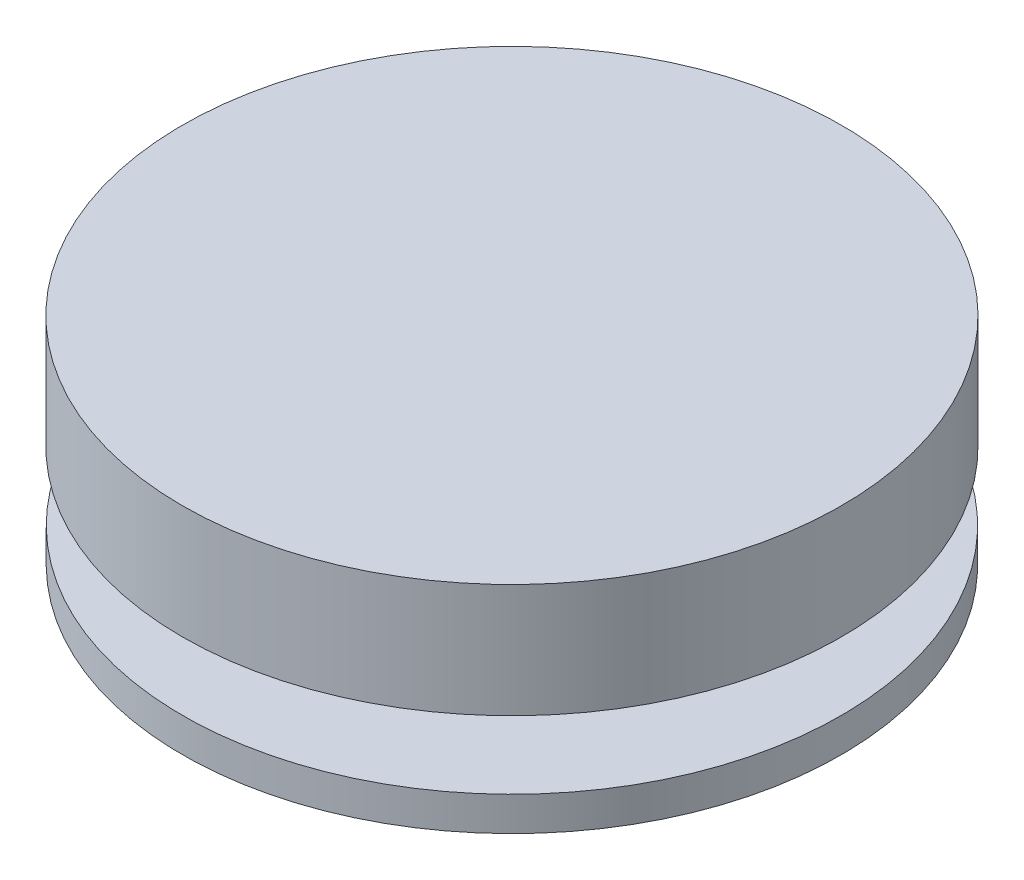
ISO-10303-21;
HEADER;
FILE_DESCRIPTION(('STEP AP214'),'2;1');
FILE_NAME('part.step','',(''),(''),'','','');
FILE_SCHEMA(('AUTOMOTIVE_DESIGN { 1 0 10303 214 1 1 1 1 }'));
ENDSEC;
DATA;
#1=APPLICATION_CONTEXT('core data for automotive mechanical design processes');
#2=APPLICATION_PROTOCOL_DEFINITION('international standard','automotive_design',2000,#1);
#3=PRODUCT_CONTEXT('',#1,'mechanical');
#4=PRODUCT('Part','Part','',(#3));
#5=PRODUCT_RELATED_PRODUCT_CATEGORY('part','',(#4));
#6=PRODUCT_DEFINITION_FORMATION('','',#4);
#7=PRODUCT_DEFINITION_CONTEXT('part definition',#1,'design');
#8=PRODUCT_DEFINITION('design','',#6,#7);
#9=PRODUCT_DEFINITION_SHAPE('','',#8);
#10=(LENGTH_UNIT() NAMED_UNIT(*) SI_UNIT(.MILLI.,.METRE.));
#11=(NAMED_UNIT(*) PLANE_ANGLE_UNIT() SI_UNIT($,.RADIAN.));
#12=(NAMED_UNIT(*) SI_UNIT($,.STERADIAN.) SOLID_ANGLE_UNIT());
#13=UNCERTAINTY_MEASURE_WITH_UNIT(LENGTH_MEASURE(1.E-05),#10,'distance_accuracy_value','');
#14=(GEOMETRIC_REPRESENTATION_CONTEXT(3) GLOBAL_UNCERTAINTY_ASSIGNED_CONTEXT((#13)) GLOBAL_UNIT_ASSIGNED_CONTEXT((#10,
#11,#12)) REPRESENTATION_CONTEXT('',''));
#15=CARTESIAN_POINT('',(0.,0.,0.));
#16=DIRECTION('',(0.,0.,1.));
#17=DIRECTION('',(1.,0.,0.));
#18=AXIS2_PLACEMENT_3D('',#15,#16,#17);
#19=CARTESIAN_POINT('',(0.,3.81,0.));
#20=DIRECTION('',(0.,-1.,0.));
#21=DIRECTION('',(0.,0.,-1.));
#22=AXIS2_PLACEMENT_3D('',#19,#20,#21);
#23=CYLINDRICAL_SURFACE('',#22,36.8);
#24=CARTESIAN_POINT('',(0.,3.81,0.));
#25=DIRECTION('',(0.,1.,0.));
#26=DIRECTION('',(0.,0.,1.));
#27=AXIS2_PLACEMENT_3D('',#24,#25,#26);
#28=CIRCLE('',#27,36.8);
#29=CARTESIAN_POINT('',(0.,3.81,-36.8));
#30=VERTEX_POINT('',#29);
#31=EDGE_CURVE('E10',#30,#30,#28,.T.);
#32=CARTESIAN_POINT('',(0.,0.,0.));
#33=DIRECTION('',(0.,1.,0.));
#34=DIRECTION('',(0.,0.,1.));
#35=AXIS2_PLACEMENT_3D('',#32,#33,#34);
#36=CIRCLE('',#35,36.8);
#37=CARTESIAN_POINT('',(0.,0.,-36.8));
#38=VERTEX_POINT('',#37);
#39=EDGE_CURVE('E34',#38,#38,#36,.T.);
#40=CARTESIAN_POINT('',(0.,3.81,-36.8));
#41=CARTESIAN_POINT('',(0.,3.7703125,-36.8));
#42=CARTESIAN_POINT('',(0.,3.730625,-36.8));
#43=CARTESIAN_POINT('',(0.,3.65125,-36.8));
#44=CARTESIAN_POINT('',(0.,3.6115625,-36.8));
#45=CARTESIAN_POINT('',(0.,3.5321875,-36.8));
#46=CARTESIAN_POINT('',(0.,3.4925,-36.8));
#47=CARTESIAN_POINT('',(0.,3.413125,-36.8));
#48=CARTESIAN_POINT('',(0.,3.3734375,-36.8));
#49=CARTESIAN_POINT('',(0.,3.2940625,-36.8));
#50=CARTESIAN_POINT('',(0.,3.254375,-36.8));
#51=CARTESIAN_POINT('',(0.,3.175,-36.8));
#52=CARTESIAN_POINT('',(0.,3.1353125,-36.8));
#53=CARTESIAN_POINT('',(0.,3.0559375,-36.8));
#54=CARTESIAN_POINT('',(0.,3.01625,-36.8));
#55=CARTESIAN_POINT('',(0.,2.936875,-36.8));
#56=CARTESIAN_POINT('',(0.,2.8971875,-36.8));
#57=CARTESIAN_POINT('',(0.,2.8178125,-36.8));
#58=CARTESIAN_POINT('',(0.,2.778125,-36.8));
#59=CARTESIAN_POINT('',(0.,2.69875,-36.8));
#60=CARTESIAN_POINT('',(0.,2.6590625,-36.8));
#61=CARTESIAN_POINT('',(0.,2.5796875,-36.8));
#62=CARTESIAN_POINT('',(0.,2.54,-36.8));
#63=CARTESIAN_POINT('',(0.,2.460625,-36.8));
#64=CARTESIAN_POINT('',(0.,2.4209375,-36.8));
#65=CARTESIAN_POINT('',(0.,2.3415625,-36.8));
#66=CARTESIAN_POINT('',(0.,2.301875,-36.8));
#67=CARTESIAN_POINT('',(0.,2.2225,-36.8));
#68=CARTESIAN_POINT('',(0.,2.1828125,-36.8));
#69=CARTESIAN_POINT('',(0.,2.1034375,-36.8));
#70=CARTESIAN_POINT('',(0.,2.06375,-36.8));
#71=CARTESIAN_POINT('',(0.,1.984375,-36.8));
#72=CARTESIAN_POINT('',(0.,1.9446875,-36.8));
#73=CARTESIAN_POINT('',(0.,1.8653125,-36.8));
#74=CARTESIAN_POINT('',(0.,1.825625,-36.8));
#75=CARTESIAN_POINT('',(0.,1.74625,-36.8));
#76=CARTESIAN_POINT('',(0.,1.7065625,-36.8));
#77=CARTESIAN_POINT('',(0.,1.6271875,-36.8));
#78=CARTESIAN_POINT('',(0.,1.5875,-36.8));
#79=CARTESIAN_POINT('',(0.,1.508125,-36.8));
#80=CARTESIAN_POINT('',(0.,1.4684375,-36.8));
#81=CARTESIAN_POINT('',(0.,1.3890625,-36.8));
#82=CARTESIAN_POINT('',(0.,1.349375,-36.8));
#83=CARTESIAN_POINT('',(0.,1.27,-36.8));
#84=CARTESIAN_POINT('',(0.,1.2303125,-36.8));
#85=CARTESIAN_POINT('',(0.,1.1509375,-36.8));
#86=CARTESIAN_POINT('',(0.,1.11125,-36.8));
#87=CARTESIAN_POINT('',(0.,1.031875,-36.8));
#88=CARTESIAN_POINT('',(0.,0.9921875,-36.8));
#89=CARTESIAN_POINT('',(0.,0.9128125,-36.8));
#90=CARTESIAN_POINT('',(0.,0.873125,-36.8));
#91=CARTESIAN_POINT('',(0.,0.79375,-36.8));
#92=CARTESIAN_POINT('',(0.,0.7540625,-36.8));
#93=CARTESIAN_POINT('',(0.,0.6746875,-36.8));
#94=CARTESIAN_POINT('',(0.,0.635,-36.8));
#95=CARTESIAN_POINT('',(0.,0.555625,-36.8));
#96=CARTESIAN_POINT('',(0.,0.5159375,-36.8));
#97=CARTESIAN_POINT('',(0.,0.4365625,-36.8));
#98=CARTESIAN_POINT('',(0.,0.396875,-36.8));
#99=CARTESIAN_POINT('',(0.,0.3175,-36.8));
#100=CARTESIAN_POINT('',(0.,0.2778125,-36.8));
#101=CARTESIAN_POINT('',(0.,0.1984375,-36.8));
#102=CARTESIAN_POINT('',(0.,0.15875,-36.8));
#103=CARTESIAN_POINT('',(0.,0.0793749999999999,-36.8));
#104=CARTESIAN_POINT('',(0.,0.0396874999999999,-36.8));
#105=CARTESIAN_POINT('',(0.,0.,-36.8));
#106=B_SPLINE_CURVE_WITH_KNOTS('',3,(#40,#41,#42,#43,#44,#45,#46,#47,#48,#49,#50,#51,#52,#53,
#54,#55,#56,#57,#58,#59,#60,#61,#62,#63,#64,#65,#66,#67,#68,#69,#70,#71,#72,#73,#74,#75,#76,#77,
#78,#79,#80,#81,#82,#83,#84,#85,#86,#87,#88,#89,#90,#91,#92,#93,#94,#95,#96,#97,#98,#99,#100,
#101,#102,#103,#104,#105),.UNSPECIFIED.,.F.,.F.,(4,2,2,2,2,2,2,2,2,2,2,2,2,2,2,2,2,2,2,2,2,2,2,
2,2,2,2,2,2,2,2,2,4),(0.,0.1190625,0.238125,0.3571875,0.47625,0.5953125,0.714375,0.8334375,
0.9525,1.0715625,1.190625,1.3096875,1.42875,1.5478125,1.666875,1.7859375,1.905,2.0240625,
2.143125,2.2621875,2.38125,2.5003125,2.619375,2.7384375,2.8575,2.9765625,3.095625,3.2146875,
3.33375,3.4528125,3.571875,3.6909375,3.81),.UNSPECIFIED.);
#107=EDGE_CURVE('BSEAM31',#30,#38,#106,.T.);
#108=ORIENTED_EDGE('',*,*,#31,.F.);
#109=ORIENTED_EDGE('',*,*,#39,.T.);
#110=ORIENTED_EDGE('',*,*,#107,.T.);
#111=ORIENTED_EDGE('',*,*,#107,.F.);
#112=EDGE_LOOP('',(#108,#110,#109,#111));
#113=FACE_BOUND('',#112,.T.);
#114=ADVANCED_FACE('F31',(#113),#23,.T.);
#115=CARTESIAN_POINT('',(0.,3.81,0.));
#116=DIRECTION('',(0.,1.,0.));
#117=DIRECTION('',(0.,0.,1.));
#118=AXIS2_PLACEMENT_3D('',#115,#116,#117);
#119=PLANE('',#118);
#120=CARTESIAN_POINT('',(0.,3.81,0.));
#121=DIRECTION('',(0.,1.,0.));
#122=DIRECTION('',(0.,0.,1.));
#123=AXIS2_PLACEMENT_3D('',#120,#121,#122);
#124=CIRCLE('',#123,15.24);
#125=CARTESIAN_POINT('',(0.,3.81,-15.24));
#126=VERTEX_POINT('',#125);
#127=EDGE_CURVE('E43',#126,#126,#124,.T.);
#128=ORIENTED_EDGE('',*,*,#127,.F.);
#129=EDGE_LOOP('',(#128));
#130=FACE_BOUND('',#129,.T.);
#131=ORIENTED_EDGE('',*,*,#31,.T.);
#132=EDGE_LOOP('',(#131));
#133=FACE_BOUND('',#132,.T.);
#134=ADVANCED_FACE('F73',(#130,#133),#119,.T.);
#135=CARTESIAN_POINT('',(0.,0.,0.));
#136=DIRECTION('',(0.,1.,0.));
#137=DIRECTION('',(0.,0.,1.));
#138=AXIS2_PLACEMENT_3D('',#135,#136,#137);
#139=PLANE('',#138);
#140=ORIENTED_EDGE('',*,*,#39,.F.);
#141=EDGE_LOOP('',(#140));
#142=FACE_BOUND('',#141,.T.);
#143=ADVANCED_FACE('F78',(#142),#139,.F.);
#144=CARTESIAN_POINT('',(0.,11.43,0.));
#145=DIRECTION('',(0.,-1.,0.));
#146=DIRECTION('',(0.,0.,-1.));
#147=AXIS2_PLACEMENT_3D('',#144,#145,#146);
#148=CYLINDRICAL_SURFACE('',#147,15.24);
#149=CARTESIAN_POINT('',(0.,11.43,0.));
#150=DIRECTION('',(0.,1.,0.));
#151=DIRECTION('',(0.,0.,1.));
#152=AXIS2_PLACEMENT_3D('',#149,#150,#151);
#153=CIRCLE('',#152,15.24);
#154=CARTESIAN_POINT('',(0.,11.43,-15.24));
#155=VERTEX_POINT('',#154);
#156=EDGE_CURVE('E41',#155,#155,#153,.T.);
#157=CARTESIAN_POINT('',(0.,11.43,-15.24));
#158=CARTESIAN_POINT('',(0.,11.350625,-15.24));
#159=CARTESIAN_POINT('',(0.,11.27125,-15.24));
#160=CARTESIAN_POINT('',(0.,11.1125,-15.24));
#161=CARTESIAN_POINT('',(0.,11.033125,-15.24));
#162=CARTESIAN_POINT('',(0.,10.874375,-15.24));
#163=CARTESIAN_POINT('',(0.,10.795,-15.24));
#164=CARTESIAN_POINT('',(0.,10.63625,-15.24));
#165=CARTESIAN_POINT('',(0.,10.556875,-15.24));
#166=CARTESIAN_POINT('',(0.,10.398125,-15.24));
#167=CARTESIAN_POINT('',(0.,10.31875,-15.24));
#168=CARTESIAN_POINT('',(0.,10.16,-15.24));
#169=CARTESIAN_POINT('',(0.,10.080625,-15.24));
#170=CARTESIAN_POINT('',(0.,9.921875,-15.24));
#171=CARTESIAN_POINT('',(0.,9.8425,-15.24));
#172=CARTESIAN_POINT('',(0.,9.68375,-15.24));
#173=CARTESIAN_POINT('',(0.,9.604375,-15.24));
#174=CARTESIAN_POINT('',(0.,9.445625,-15.24));
#175=CARTESIAN_POINT('',(0.,9.36625,-15.24));
#176=CARTESIAN_POINT('',(0.,9.2075,-15.24));
#177=CARTESIAN_POINT('',(0.,9.128125,-15.24));
#178=CARTESIAN_POINT('',(0.,8.969375,-15.24));
#179=CARTESIAN_POINT('',(0.,8.89,-15.24));
#180=CARTESIAN_POINT('',(0.,8.73125,-15.24));
#181=CARTESIAN_POINT('',(0.,8.651875,-15.24));
#182=CARTESIAN_POINT('',(0.,8.493125,-15.24));
#183=CARTESIAN_POINT('',(0.,8.41375,-15.24));
#184=CARTESIAN_POINT('',(0.,8.255,-15.24));
#185=CARTESIAN_POINT('',(0.,8.175625,-15.24));
#186=CARTESIAN_POINT('',(0.,8.016875,-15.24));
#187=CARTESIAN_POINT('',(0.,7.9375,-15.24));
#188=CARTESIAN_POINT('',(0.,7.77875,-15.24));
#189=CARTESIAN_POINT('',(0.,7.699375,-15.24));
#190=CARTESIAN_POINT('',(0.,7.540625,-15.24));
#191=CARTESIAN_POINT('',(0.,7.46125,-15.24));
#192=CARTESIAN_POINT('',(0.,7.3025,-15.24));
#193=CARTESIAN_POINT('',(0.,7.223125,-15.24));
#194=CARTESIAN_POINT('',(0.,7.064375,-15.24));
#195=CARTESIAN_POINT('',(0.,6.985,-15.24));
#196=CARTESIAN_POINT('',(0.,6.82625,-15.24));
#197=CARTESIAN_POINT('',(0.,6.746875,-15.24));
#198=CARTESIAN_POINT('',(0.,6.588125,-15.24));
#199=CARTESIAN_POINT('',(0.,6.50875,-15.24));
#200=CARTESIAN_POINT('',(0.,6.35,-15.24));
#201=CARTESIAN_POINT('',(0.,6.270625,-15.24));
#202=CARTESIAN_POINT('',(0.,6.111875,-15.24));
#203=CARTESIAN_POINT('',(0.,6.0325,-15.24));
#204=CARTESIAN_POINT('',(0.,5.87375,-15.24));
#205=CARTESIAN_POINT('',(0.,5.794375,-15.24));
#206=CARTESIAN_POINT('',(0.,5.635625,-15.24));
#207=CARTESIAN_POINT('',(0.,5.55625,-15.24));
#208=CARTESIAN_POINT('',(0.,5.3975,-15.24));
#209=CARTESIAN_POINT('',(0.,5.318125,-15.24));
#210=CARTESIAN_POINT('',(0.,5.159375,-15.24));
#211=CARTESIAN_POINT('',(0.,5.08,-15.24));
#212=CARTESIAN_POINT('',(0.,4.92125,-15.24));
#213=CARTESIAN_POINT('',(0.,4.841875,-15.24));
#214=CARTESIAN_POINT('',(0.,4.683125,-15.24));
#215=CARTESIAN_POINT('',(0.,4.60375,-15.24));
#216=CARTESIAN_POINT('',(0.,4.445,-15.24));
#217=CARTESIAN_POINT('',(0.,4.365625,-15.24));
#218=CARTESIAN_POINT('',(0.,4.206875,-15.24));
#219=CARTESIAN_POINT('',(0.,4.1275,-15.24));
#220=CARTESIAN_POINT('',(0.,3.96875,-15.24));
#221=CARTESIAN_POINT('',(0.,3.889375,-15.24));
#222=CARTESIAN_POINT('',(0.,3.81,-15.24));
#223=B_SPLINE_CURVE_WITH_KNOTS('',3,(#157,#158,#159,#160,#161,#162,#163,#164,#165,#166,#167,
#168,#169,#170,#171,#172,#173,#174,#175,#176,#177,#178,#179,#180,#181,#182,#183,#184,#185,#186,
#187,#188,#189,#190,#191,#192,#193,#194,#195,#196,#197,#198,#199,#200,#201,#202,#203,#204,#205,
#206,#207,#208,#209,#210,#211,#212,#213,#214,#215,#216,#217,#218,#219,#220,#221,#222),
.UNSPECIFIED.,.F.,.F.,(4,2,2,2,2,2,2,2,2,2,2,2,2,2,2,2,2,2,2,2,2,2,2,2,2,2,2,2,2,2,2,2,4),(0.,
0.238125,0.476250000000001,0.714375000000001,0.9525,1.190625,1.42875,1.666875,1.905,2.143125,
2.38125,2.619375,2.8575,3.095625,3.33375,3.571875,3.81,4.048125,4.28625,4.524375,4.7625,
5.000625,5.23875,5.476875,5.715,5.953125,6.19125,6.429375,6.6675,6.905625,7.14375,7.381875,
7.62),.UNSPECIFIED.);
#224=EDGE_CURVE('BSEAM60',#155,#126,#223,.T.);
#225=ORIENTED_EDGE('',*,*,#156,.F.);
#226=ORIENTED_EDGE('',*,*,#127,.T.);
#227=ORIENTED_EDGE('',*,*,#224,.T.);
#228=ORIENTED_EDGE('',*,*,#224,.F.);
#229=EDGE_LOOP('',(#225,#227,#226,#228));
#230=FACE_BOUND('',#229,.T.);
#231=ADVANCED_FACE('F60',(#230),#148,.T.);
#232=CARTESIAN_POINT('',(0.,24.13,0.));
#233=DIRECTION('',(0.,-1.,0.));
#234=DIRECTION('',(0.,0.,-1.));
#235=AXIS2_PLACEMENT_3D('',#232,#233,#234);
#236=CYLINDRICAL_SURFACE('',#235,36.83);
#237=CARTESIAN_POINT('',(0.,24.13,0.));
#238=DIRECTION('',(0.,1.,0.));
#239=DIRECTION('',(0.,0.,1.));
#240=AXIS2_PLACEMENT_3D('',#237,#238,#239);
#241=CIRCLE('',#240,36.83);
#242=CARTESIAN_POINT('',(0.,24.13,36.83));
#243=VERTEX_POINT('',#242);
#244=EDGE_CURVE('E46',#243,#243,#241,.T.);
#245=ORIENTED_EDGE('',*,*,#244,.F.);
#246=EDGE_LOOP('',(#245));
#247=FACE_BOUND('',#246,.T.);
#248=CARTESIAN_POINT('',(0.,11.43,0.));
#249=DIRECTION('',(0.,1.,0.));
#250=DIRECTION('',(0.,0.,1.));
#251=AXIS2_PLACEMENT_3D('',#248,#249,#250);
#252=CIRCLE('',#251,36.83);
#253=CARTESIAN_POINT('',(0.,11.43,36.83));
#254=VERTEX_POINT('',#253);
#255=EDGE_CURVE('E49',#254,#254,#252,.T.);
#256=ORIENTED_EDGE('',*,*,#255,.T.);
#257=EDGE_LOOP('',(#256));
#258=FACE_BOUND('',#257,.T.);
#259=ADVANCED_FACE('F57',(#247,#258),#236,.T.);
#260=CARTESIAN_POINT('',(0.,24.13,0.));
#261=DIRECTION('',(0.,1.,0.));
#262=DIRECTION('',(0.,0.,1.));
#263=AXIS2_PLACEMENT_3D('',#260,#261,#262);
#264=PLANE('',#263);
#265=ORIENTED_EDGE('',*,*,#244,.T.);
#266=EDGE_LOOP('',(#265));
#267=FACE_BOUND('',#266,.T.);
#268=ADVANCED_FACE('F55',(#267),#264,.T.);
#269=CARTESIAN_POINT('',(0.,11.43,0.));
#270=DIRECTION('',(0.,1.,0.));
#271=DIRECTION('',(0.,0.,1.));
#272=AXIS2_PLACEMENT_3D('',#269,#270,#271);
#273=PLANE('',#272);
#274=ORIENTED_EDGE('',*,*,#156,.T.);
#275=EDGE_LOOP('',(#274));
#276=FACE_BOUND('',#275,.T.);
#277=ORIENTED_EDGE('',*,*,#255,.F.);
#278=EDGE_LOOP('',(#277));
#279=FACE_BOUND('',#278,.T.);
#280=ADVANCED_FACE('F64',(#276,#279),#273,.F.);
#281=CLOSED_SHELL('',(#114,#134,#143,#231,#259,#268,#280));
#282=MANIFOLD_SOLID_BREP('B2',#281);
#283=ADVANCED_BREP_SHAPE_REPRESENTATION('',(#18,#282),#14);
#284=SHAPE_DEFINITION_REPRESENTATION(#9,#283);
ENDSEC;
END-ISO-10303-21;
